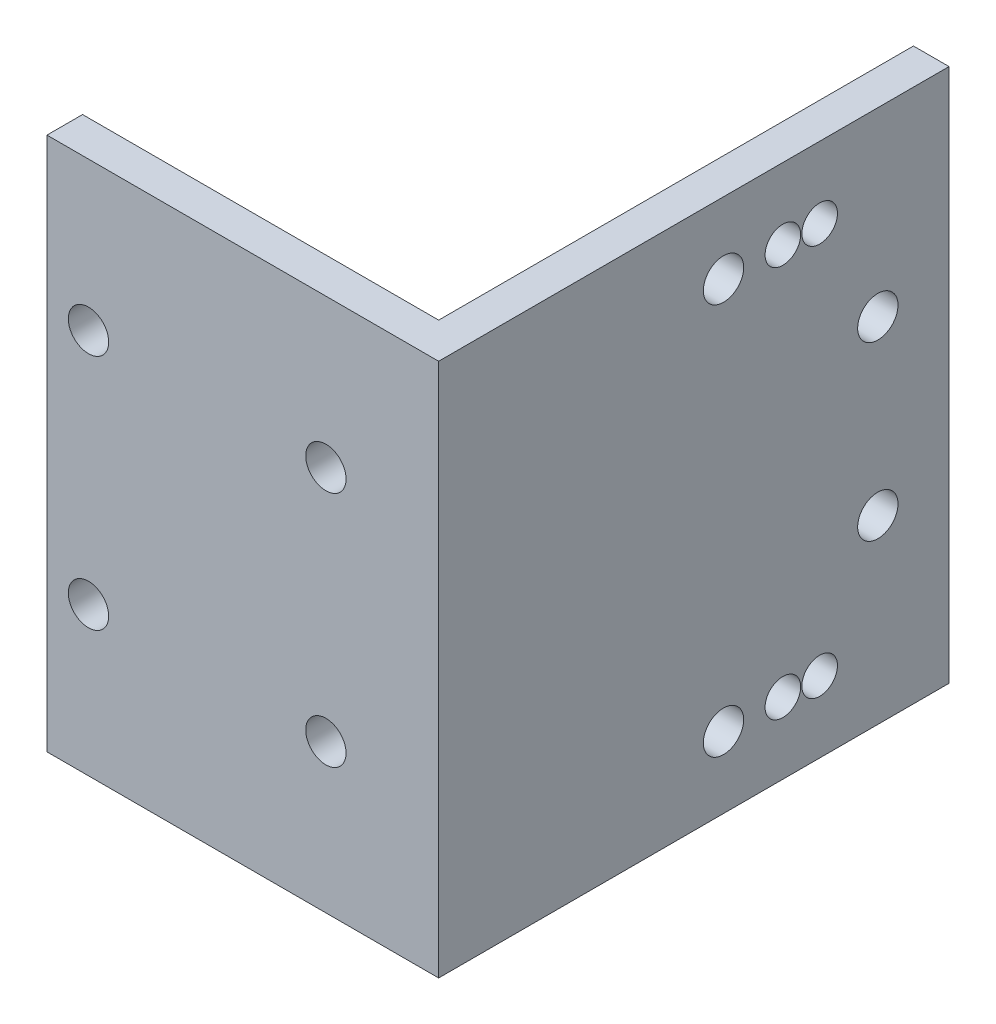
ISO-10303-21;
HEADER;
FILE_DESCRIPTION(('STEP AP214'),'2;1');
FILE_NAME('part.step','',(''),(''),'','','');
FILE_SCHEMA(('AUTOMOTIVE_DESIGN { 1 0 10303 214 1 1 1 1 }'));
ENDSEC;
DATA;
#1=APPLICATION_CONTEXT('core data for automotive mechanical design processes');
#2=APPLICATION_PROTOCOL_DEFINITION('international standard','automotive_design',2000,#1);
#3=PRODUCT_CONTEXT('',#1,'mechanical');
#4=PRODUCT('Part','Part','',(#3));
#5=PRODUCT_RELATED_PRODUCT_CATEGORY('part','',(#4));
#6=PRODUCT_DEFINITION_FORMATION('','',#4);
#7=PRODUCT_DEFINITION_CONTEXT('part definition',#1,'design');
#8=PRODUCT_DEFINITION('design','',#6,#7);
#9=PRODUCT_DEFINITION_SHAPE('','',#8);
#10=(LENGTH_UNIT() NAMED_UNIT(*) SI_UNIT(.MILLI.,.METRE.));
#11=(NAMED_UNIT(*) PLANE_ANGLE_UNIT() SI_UNIT($,.RADIAN.));
#12=(NAMED_UNIT(*) SI_UNIT($,.STERADIAN.) SOLID_ANGLE_UNIT());
#13=UNCERTAINTY_MEASURE_WITH_UNIT(LENGTH_MEASURE(1.E-05),#10,'distance_accuracy_value','');
#14=(GEOMETRIC_REPRESENTATION_CONTEXT(3) GLOBAL_UNCERTAINTY_ASSIGNED_CONTEXT((#13)) GLOBAL_UNIT_ASSIGNED_CONTEXT((#10,
#11,#12)) REPRESENTATION_CONTEXT('',''));
#15=CARTESIAN_POINT('',(0.,0.,0.));
#16=DIRECTION('',(0.,0.,1.));
#17=DIRECTION('',(1.,0.,0.));
#18=AXIS2_PLACEMENT_3D('',#15,#16,#17);
#19=CARTESIAN_POINT('',(0.,45.,0.));
#20=DIRECTION('',(1.,0.,0.));
#21=DIRECTION('',(0.,0.,-1.));
#22=AXIS2_PLACEMENT_3D('',#19,#20,#21);
#23=PLANE('',#22);
#24=DIRECTION('',(0.,0.,1.));
#25=VECTOR('',#24,1.);
#26=CARTESIAN_POINT('',(0.,0.,0.));
#27=LINE('',#26,#25);
#28=CARTESIAN_POINT('',(0.,0.,0.));
#29=VERTEX_POINT('',#28);
#30=CARTESIAN_POINT('',(0.,0.,3.));
#31=VERTEX_POINT('',#30);
#32=EDGE_CURVE('E130',#29,#31,#27,.T.);
#33=ORIENTED_EDGE('',*,*,#32,.T.);
#34=DIRECTION('',(0.,-1.,0.));
#35=VECTOR('',#34,1.);
#36=CARTESIAN_POINT('',(0.,45.,3.));
#37=LINE('',#36,#35);
#38=CARTESIAN_POINT('',(0.,45.,3.));
#39=VERTEX_POINT('',#38);
#40=EDGE_CURVE('E42',#39,#31,#37,.T.);
#41=ORIENTED_EDGE('',*,*,#40,.F.);
#42=DIRECTION('',(0.,0.,1.));
#43=VECTOR('',#42,1.);
#44=CARTESIAN_POINT('',(0.,45.,0.));
#45=LINE('',#44,#43);
#46=CARTESIAN_POINT('',(0.,45.,0.));
#47=VERTEX_POINT('',#46);
#48=EDGE_CURVE('E113',#47,#39,#45,.T.);
#49=ORIENTED_EDGE('',*,*,#48,.F.);
#50=DIRECTION('',(0.,-1.,0.));
#51=VECTOR('',#50,1.);
#52=CARTESIAN_POINT('',(0.,45.,0.));
#53=LINE('',#52,#51);
#54=EDGE_CURVE('E119',#47,#29,#53,.T.);
#55=ORIENTED_EDGE('',*,*,#54,.T.);
#56=EDGE_LOOP('',(#33,#41,#49,#55));
#57=FACE_BOUND('',#56,.T.);
#58=ADVANCED_FACE('F35',(#57),#23,.F.);
#59=CARTESIAN_POINT('',(0.,45.,3.));
#60=DIRECTION('',(0.,0.,-1.));
#61=DIRECTION('',(-1.,0.,0.));
#62=AXIS2_PLACEMENT_3D('',#59,#60,#61);
#63=PLANE('',#62);
#64=CARTESIAN_POINT('',(3.5,12.5,3.));
#65=DIRECTION('',(0.,0.,1.));
#66=DIRECTION('',(1.,0.,0.));
#67=AXIS2_PLACEMENT_3D('',#64,#65,#66);
#68=CIRCLE('',#67,1.7);
#69=CARTESIAN_POINT('',(5.2,12.5,3.));
#70=VERTEX_POINT('',#69);
#71=EDGE_CURVE('E161',#70,#70,#68,.T.);
#72=ORIENTED_EDGE('',*,*,#71,.F.);
#73=EDGE_LOOP('',(#72));
#74=FACE_BOUND('',#73,.T.);
#75=CARTESIAN_POINT('',(23.5,12.5,3.));
#76=DIRECTION('',(0.,0.,1.));
#77=DIRECTION('',(1.,0.,0.));
#78=AXIS2_PLACEMENT_3D('',#75,#76,#77);
#79=CIRCLE('',#78,1.7);
#80=CARTESIAN_POINT('',(25.2,12.5,3.));
#81=VERTEX_POINT('',#80);
#82=EDGE_CURVE('E155',#81,#81,#79,.T.);
#83=ORIENTED_EDGE('',*,*,#82,.F.);
#84=EDGE_LOOP('',(#83));
#85=FACE_BOUND('',#84,.T.);
#86=CARTESIAN_POINT('',(23.5,32.5,3.));
#87=DIRECTION('',(0.,0.,1.));
#88=DIRECTION('',(1.,0.,0.));
#89=AXIS2_PLACEMENT_3D('',#86,#87,#88);
#90=CIRCLE('',#89,1.7);
#91=CARTESIAN_POINT('',(25.2,32.5,3.));
#92=VERTEX_POINT('',#91);
#93=EDGE_CURVE('E149',#92,#92,#90,.T.);
#94=ORIENTED_EDGE('',*,*,#93,.F.);
#95=EDGE_LOOP('',(#94));
#96=FACE_BOUND('',#95,.T.);
#97=CARTESIAN_POINT('',(3.5,32.5,3.));
#98=DIRECTION('',(0.,0.,1.));
#99=DIRECTION('',(1.,0.,0.));
#100=AXIS2_PLACEMENT_3D('',#97,#98,#99);
#101=CIRCLE('',#100,1.7);
#102=CARTESIAN_POINT('',(5.2,32.5,3.));
#103=VERTEX_POINT('',#102);
#104=EDGE_CURVE('E134',#103,#103,#101,.T.);
#105=ORIENTED_EDGE('',*,*,#104,.F.);
#106=EDGE_LOOP('',(#105));
#107=FACE_BOUND('',#106,.T.);
#108=DIRECTION('',(1.,0.,0.));
#109=VECTOR('',#108,1.);
#110=CARTESIAN_POINT('',(0.,0.,3.));
#111=LINE('',#110,#109);
#112=CARTESIAN_POINT('',(33.,0.,3.));
#113=VERTEX_POINT('',#112);
#114=EDGE_CURVE('E115',#31,#113,#111,.T.);
#115=ORIENTED_EDGE('',*,*,#114,.T.);
#116=DIRECTION('',(0.,-1.,0.));
#117=VECTOR('',#116,1.);
#118=CARTESIAN_POINT('',(33.,45.,3.));
#119=LINE('',#118,#117);
#120=CARTESIAN_POINT('',(33.,45.,3.));
#121=VERTEX_POINT('',#120);
#122=EDGE_CURVE('E123',#121,#113,#119,.T.);
#123=ORIENTED_EDGE('',*,*,#122,.F.);
#124=DIRECTION('',(1.,0.,0.));
#125=VECTOR('',#124,1.);
#126=CARTESIAN_POINT('',(0.,45.,3.));
#127=LINE('',#126,#125);
#128=EDGE_CURVE('E86',#39,#121,#127,.T.);
#129=ORIENTED_EDGE('',*,*,#128,.F.);
#130=ORIENTED_EDGE('',*,*,#40,.T.);
#131=EDGE_LOOP('',(#115,#123,#129,#130));
#132=FACE_BOUND('',#131,.T.);
#133=ADVANCED_FACE('F127',(#74,#85,#96,#107,#132),#63,.F.);
#134=CARTESIAN_POINT('',(33.,45.,3.));
#135=DIRECTION('',(-1.,0.,0.));
#136=DIRECTION('',(0.,0.,1.));
#137=AXIS2_PLACEMENT_3D('',#134,#135,#136);
#138=PLANE('',#137);
#139=CARTESIAN_POINT('',(33.,6.00000000000001,-26.));
#140=DIRECTION('',(1.,0.,0.));
#141=DIRECTION('',(0.,0.,1.));
#142=AXIS2_PLACEMENT_3D('',#139,#140,#141);
#143=CIRCLE('',#142,1.5);
#144=CARTESIAN_POINT('',(33.,6.00000000000001,-24.5));
#145=VERTEX_POINT('',#144);
#146=EDGE_CURVE('E209',#145,#145,#143,.T.);
#147=ORIENTED_EDGE('',*,*,#146,.F.);
#148=EDGE_LOOP('',(#147));
#149=FACE_BOUND('',#148,.T.);
#150=CARTESIAN_POINT('',(33.,6.00000000000001,-29.1));
#151=DIRECTION('',(1.,0.,0.));
#152=DIRECTION('',(0.,0.,1.));
#153=AXIS2_PLACEMENT_3D('',#150,#151,#152);
#154=CIRCLE('',#153,1.5);
#155=CARTESIAN_POINT('',(33.,6.00000000000001,-27.6));
#156=VERTEX_POINT('',#155);
#157=EDGE_CURVE('E203',#156,#156,#154,.T.);
#158=ORIENTED_EDGE('',*,*,#157,.F.);
#159=EDGE_LOOP('',(#158));
#160=FACE_BOUND('',#159,.T.);
#161=CARTESIAN_POINT('',(33.,39.,-29.1));
#162=DIRECTION('',(1.,0.,0.));
#163=DIRECTION('',(0.,0.,-1.));
#164=AXIS2_PLACEMENT_3D('',#161,#162,#163);
#165=CIRCLE('',#164,1.5);
#166=CARTESIAN_POINT('',(33.,39.,-30.6));
#167=VERTEX_POINT('',#166);
#168=EDGE_CURVE('E197',#167,#167,#165,.T.);
#169=ORIENTED_EDGE('',*,*,#168,.F.);
#170=EDGE_LOOP('',(#169));
#171=FACE_BOUND('',#170,.T.);
#172=CARTESIAN_POINT('',(33.,39.,-26.));
#173=DIRECTION('',(1.,0.,0.));
#174=DIRECTION('',(0.,0.,-1.));
#175=AXIS2_PLACEMENT_3D('',#172,#173,#174);
#176=CIRCLE('',#175,1.5);
#177=CARTESIAN_POINT('',(33.,39.,-27.5));
#178=VERTEX_POINT('',#177);
#179=EDGE_CURVE('E191',#178,#178,#176,.T.);
#180=ORIENTED_EDGE('',*,*,#179,.F.);
#181=EDGE_LOOP('',(#180));
#182=FACE_BOUND('',#181,.T.);
#183=CARTESIAN_POINT('',(33.,29.75,-34.));
#184=DIRECTION('',(1.,0.,0.));
#185=DIRECTION('',(0.,0.,-1.));
#186=AXIS2_PLACEMENT_3D('',#183,#184,#185);
#187=CIRCLE('',#186,1.7);
#188=CARTESIAN_POINT('',(33.,29.75,-35.7));
#189=VERTEX_POINT('',#188);
#190=EDGE_CURVE('E185',#189,#189,#187,.T.);
#191=ORIENTED_EDGE('',*,*,#190,.F.);
#192=EDGE_LOOP('',(#191));
#193=FACE_BOUND('',#192,.T.);
#194=CARTESIAN_POINT('',(33.,15.25,-34.));
#195=DIRECTION('',(1.,0.,0.));
#196=DIRECTION('',(0.,0.,-1.));
#197=AXIS2_PLACEMENT_3D('',#194,#195,#196);
#198=CIRCLE('',#197,1.7);
#199=CARTESIAN_POINT('',(33.,15.25,-35.7));
#200=VERTEX_POINT('',#199);
#201=EDGE_CURVE('E179',#200,#200,#198,.T.);
#202=ORIENTED_EDGE('',*,*,#201,.F.);
#203=EDGE_LOOP('',(#202));
#204=FACE_BOUND('',#203,.T.);
#205=CARTESIAN_POINT('',(33.,39.,-21.));
#206=DIRECTION('',(1.,0.,0.));
#207=DIRECTION('',(0.,0.,-1.));
#208=AXIS2_PLACEMENT_3D('',#205,#206,#207);
#209=CIRCLE('',#208,1.7);
#210=CARTESIAN_POINT('',(33.,39.,-22.7));
#211=VERTEX_POINT('',#210);
#212=EDGE_CURVE('E173',#211,#211,#209,.T.);
#213=ORIENTED_EDGE('',*,*,#212,.F.);
#214=EDGE_LOOP('',(#213));
#215=FACE_BOUND('',#214,.T.);
#216=CARTESIAN_POINT('',(33.,6.,-21.));
#217=DIRECTION('',(1.,0.,0.));
#218=DIRECTION('',(0.,0.,-1.));
#219=AXIS2_PLACEMENT_3D('',#216,#217,#218);
#220=CIRCLE('',#219,1.7);
#221=CARTESIAN_POINT('',(33.,6.,-22.7));
#222=VERTEX_POINT('',#221);
#223=EDGE_CURVE('E167',#222,#222,#220,.T.);
#224=ORIENTED_EDGE('',*,*,#223,.F.);
#225=EDGE_LOOP('',(#224));
#226=FACE_BOUND('',#225,.T.);
#227=DIRECTION('',(0.,0.,-1.));
#228=VECTOR('',#227,1.);
#229=CARTESIAN_POINT('',(33.,0.,3.));
#230=LINE('',#229,#228);
#231=CARTESIAN_POINT('',(33.,0.,-40.));
#232=VERTEX_POINT('',#231);
#233=EDGE_CURVE('E111',#113,#232,#230,.T.);
#234=ORIENTED_EDGE('',*,*,#233,.T.);
#235=DIRECTION('',(0.,1.,0.));
#236=VECTOR('',#235,1.);
#237=CARTESIAN_POINT('',(33.,45.,-40.));
#238=LINE('',#237,#236);
#239=CARTESIAN_POINT('',(33.,45.,-40.));
#240=VERTEX_POINT('',#239);
#241=EDGE_CURVE('E49',#232,#240,#238,.T.);
#242=ORIENTED_EDGE('',*,*,#241,.T.);
#243=DIRECTION('',(0.,0.,-1.));
#244=VECTOR('',#243,1.);
#245=CARTESIAN_POINT('',(33.,45.,3.));
#246=LINE('',#245,#244);
#247=EDGE_CURVE('E139',#121,#240,#246,.T.);
#248=ORIENTED_EDGE('',*,*,#247,.F.);
#249=ORIENTED_EDGE('',*,*,#122,.T.);
#250=EDGE_LOOP('',(#234,#242,#248,#249));
#251=FACE_BOUND('',#250,.T.);
#252=ADVANCED_FACE('F215',(#149,#160,#171,#182,#193,#204,#215,#226,#251),#138,.F.);
#253=CARTESIAN_POINT('',(30.,45.,0.));
#254=DIRECTION('',(1.,0.,0.));
#255=DIRECTION('',(0.,0.,-1.));
#256=AXIS2_PLACEMENT_3D('',#253,#254,#255);
#257=PLANE('',#256);
#258=CARTESIAN_POINT('',(30.,6.00000000000001,-26.));
#259=DIRECTION('',(1.,0.,0.));
#260=DIRECTION('',(0.,0.,-1.));
#261=AXIS2_PLACEMENT_3D('',#258,#259,#260);
#262=CIRCLE('',#261,1.5);
#263=CARTESIAN_POINT('',(30.,6.00000000000001,-27.5));
#264=VERTEX_POINT('',#263);
#265=EDGE_CURVE('E206',#264,#264,#262,.F.);
#266=ORIENTED_EDGE('',*,*,#265,.F.);
#267=EDGE_LOOP('',(#266));
#268=FACE_BOUND('',#267,.T.);
#269=CARTESIAN_POINT('',(30.,6.00000000000001,-29.1));
#270=DIRECTION('',(1.,0.,0.));
#271=DIRECTION('',(0.,0.,-1.));
#272=AXIS2_PLACEMENT_3D('',#269,#270,#271);
#273=CIRCLE('',#272,1.5);
#274=CARTESIAN_POINT('',(30.,6.00000000000001,-30.6));
#275=VERTEX_POINT('',#274);
#276=EDGE_CURVE('E200',#275,#275,#273,.F.);
#277=ORIENTED_EDGE('',*,*,#276,.F.);
#278=EDGE_LOOP('',(#277));
#279=FACE_BOUND('',#278,.T.);
#280=CARTESIAN_POINT('',(30.,39.,-29.1));
#281=DIRECTION('',(1.,0.,0.));
#282=DIRECTION('',(0.,0.,-1.));
#283=AXIS2_PLACEMENT_3D('',#280,#281,#282);
#284=CIRCLE('',#283,1.5);
#285=CARTESIAN_POINT('',(30.,39.,-30.6));
#286=VERTEX_POINT('',#285);
#287=EDGE_CURVE('E194',#286,#286,#284,.F.);
#288=ORIENTED_EDGE('',*,*,#287,.F.);
#289=EDGE_LOOP('',(#288));
#290=FACE_BOUND('',#289,.T.);
#291=CARTESIAN_POINT('',(30.,39.,-26.));
#292=DIRECTION('',(1.,0.,0.));
#293=DIRECTION('',(0.,0.,-1.));
#294=AXIS2_PLACEMENT_3D('',#291,#292,#293);
#295=CIRCLE('',#294,1.5);
#296=CARTESIAN_POINT('',(30.,39.,-27.5));
#297=VERTEX_POINT('',#296);
#298=EDGE_CURVE('E188',#297,#297,#295,.F.);
#299=ORIENTED_EDGE('',*,*,#298,.F.);
#300=EDGE_LOOP('',(#299));
#301=FACE_BOUND('',#300,.T.);
#302=CARTESIAN_POINT('',(30.,29.75,-34.));
#303=DIRECTION('',(1.,0.,0.));
#304=DIRECTION('',(0.,0.,-1.));
#305=AXIS2_PLACEMENT_3D('',#302,#303,#304);
#306=CIRCLE('',#305,1.7);
#307=CARTESIAN_POINT('',(30.,29.75,-35.7));
#308=VERTEX_POINT('',#307);
#309=EDGE_CURVE('E182',#308,#308,#306,.F.);
#310=ORIENTED_EDGE('',*,*,#309,.F.);
#311=EDGE_LOOP('',(#310));
#312=FACE_BOUND('',#311,.T.);
#313=CARTESIAN_POINT('',(30.,15.25,-34.));
#314=DIRECTION('',(1.,0.,0.));
#315=DIRECTION('',(0.,0.,-1.));
#316=AXIS2_PLACEMENT_3D('',#313,#314,#315);
#317=CIRCLE('',#316,1.7);
#318=CARTESIAN_POINT('',(30.,15.25,-35.7));
#319=VERTEX_POINT('',#318);
#320=EDGE_CURVE('E176',#319,#319,#317,.F.);
#321=ORIENTED_EDGE('',*,*,#320,.F.);
#322=EDGE_LOOP('',(#321));
#323=FACE_BOUND('',#322,.T.);
#324=CARTESIAN_POINT('',(30.,39.,-21.));
#325=DIRECTION('',(1.,0.,0.));
#326=DIRECTION('',(0.,0.,-1.));
#327=AXIS2_PLACEMENT_3D('',#324,#325,#326);
#328=CIRCLE('',#327,1.7);
#329=CARTESIAN_POINT('',(30.,39.,-22.7));
#330=VERTEX_POINT('',#329);
#331=EDGE_CURVE('E170',#330,#330,#328,.F.);
#332=ORIENTED_EDGE('',*,*,#331,.F.);
#333=EDGE_LOOP('',(#332));
#334=FACE_BOUND('',#333,.T.);
#335=CARTESIAN_POINT('',(30.,6.,-21.));
#336=DIRECTION('',(1.,0.,0.));
#337=DIRECTION('',(0.,0.,-1.));
#338=AXIS2_PLACEMENT_3D('',#335,#336,#337);
#339=CIRCLE('',#338,1.7);
#340=CARTESIAN_POINT('',(30.,6.,-22.7));
#341=VERTEX_POINT('',#340);
#342=EDGE_CURVE('E164',#341,#341,#339,.F.);
#343=ORIENTED_EDGE('',*,*,#342,.F.);
#344=EDGE_LOOP('',(#343));
#345=FACE_BOUND('',#344,.T.);
#346=DIRECTION('',(0.,0.,1.));
#347=VECTOR('',#346,1.);
#348=CARTESIAN_POINT('',(30.,45.,0.));
#349=LINE('',#348,#347);
#350=CARTESIAN_POINT('',(30.,45.,-40.));
#351=VERTEX_POINT('',#350);
#352=CARTESIAN_POINT('',(30.,45.,0.));
#353=VERTEX_POINT('',#352);
#354=EDGE_CURVE('E106',#351,#353,#349,.T.);
#355=ORIENTED_EDGE('',*,*,#354,.F.);
#356=DIRECTION('',(0.,-1.,0.));
#357=VECTOR('',#356,1.);
#358=CARTESIAN_POINT('',(30.,45.,-40.));
#359=LINE('',#358,#357);
#360=CARTESIAN_POINT('',(30.,0.,-40.));
#361=VERTEX_POINT('',#360);
#362=EDGE_CURVE('E95',#351,#361,#359,.T.);
#363=ORIENTED_EDGE('',*,*,#362,.T.);
#364=DIRECTION('',(0.,0.,1.));
#365=VECTOR('',#364,1.);
#366=CARTESIAN_POINT('',(30.,0.,0.));
#367=LINE('',#366,#365);
#368=CARTESIAN_POINT('',(30.,0.,0.));
#369=VERTEX_POINT('',#368);
#370=EDGE_CURVE('E105',#361,#369,#367,.T.);
#371=ORIENTED_EDGE('',*,*,#370,.T.);
#372=DIRECTION('',(0.,-1.,0.));
#373=VECTOR('',#372,1.);
#374=CARTESIAN_POINT('',(30.,45.,0.));
#375=LINE('',#374,#373);
#376=EDGE_CURVE('E121',#353,#369,#375,.T.);
#377=ORIENTED_EDGE('',*,*,#376,.F.);
#378=EDGE_LOOP('',(#355,#363,#371,#377));
#379=FACE_BOUND('',#378,.T.);
#380=ADVANCED_FACE('F103',(#268,#279,#290,#301,#312,#323,#334,#345,#379),#257,.F.);
#381=CARTESIAN_POINT('',(0.,45.,0.));
#382=DIRECTION('',(0.,0.,1.));
#383=DIRECTION('',(1.,0.,0.));
#384=AXIS2_PLACEMENT_3D('',#381,#382,#383);
#385=PLANE('',#384);
#386=CARTESIAN_POINT('',(3.5,12.5,0.));
#387=DIRECTION('',(0.,0.,1.));
#388=DIRECTION('',(1.,0.,0.));
#389=AXIS2_PLACEMENT_3D('',#386,#387,#388);
#390=CIRCLE('',#389,1.7);
#391=CARTESIAN_POINT('',(5.2,12.5,0.));
#392=VERTEX_POINT('',#391);
#393=EDGE_CURVE('E158',#392,#392,#390,.F.);
#394=ORIENTED_EDGE('',*,*,#393,.F.);
#395=EDGE_LOOP('',(#394));
#396=FACE_BOUND('',#395,.T.);
#397=CARTESIAN_POINT('',(23.5,12.5,0.));
#398=DIRECTION('',(0.,0.,1.));
#399=DIRECTION('',(1.,0.,0.));
#400=AXIS2_PLACEMENT_3D('',#397,#398,#399);
#401=CIRCLE('',#400,1.7);
#402=CARTESIAN_POINT('',(25.2,12.5,0.));
#403=VERTEX_POINT('',#402);
#404=EDGE_CURVE('E152',#403,#403,#401,.F.);
#405=ORIENTED_EDGE('',*,*,#404,.F.);
#406=EDGE_LOOP('',(#405));
#407=FACE_BOUND('',#406,.T.);
#408=CARTESIAN_POINT('',(23.5,32.5,0.));
#409=DIRECTION('',(0.,0.,1.));
#410=DIRECTION('',(1.,0.,0.));
#411=AXIS2_PLACEMENT_3D('',#408,#409,#410);
#412=CIRCLE('',#411,1.7);
#413=CARTESIAN_POINT('',(25.2,32.5,0.));
#414=VERTEX_POINT('',#413);
#415=EDGE_CURVE('E146',#414,#414,#412,.F.);
#416=ORIENTED_EDGE('',*,*,#415,.F.);
#417=EDGE_LOOP('',(#416));
#418=FACE_BOUND('',#417,.T.);
#419=CARTESIAN_POINT('',(3.5,32.5,0.));
#420=DIRECTION('',(0.,0.,1.));
#421=DIRECTION('',(1.,0.,0.));
#422=AXIS2_PLACEMENT_3D('',#419,#420,#421);
#423=CIRCLE('',#422,1.7);
#424=CARTESIAN_POINT('',(5.2,32.5,0.));
#425=VERTEX_POINT('',#424);
#426=EDGE_CURVE('E131',#425,#425,#423,.F.);
#427=ORIENTED_EDGE('',*,*,#426,.F.);
#428=EDGE_LOOP('',(#427));
#429=FACE_BOUND('',#428,.T.);
#430=DIRECTION('',(-1.,0.,0.));
#431=VECTOR('',#430,1.);
#432=CARTESIAN_POINT('',(0.,0.,0.));
#433=LINE('',#432,#431);
#434=EDGE_CURVE('E78',#369,#29,#433,.T.);
#435=ORIENTED_EDGE('',*,*,#434,.T.);
#436=ORIENTED_EDGE('',*,*,#54,.F.);
#437=DIRECTION('',(-1.,0.,0.));
#438=VECTOR('',#437,1.);
#439=CARTESIAN_POINT('',(0.,45.,0.));
#440=LINE('',#439,#438);
#441=EDGE_CURVE('E57',#353,#47,#440,.T.);
#442=ORIENTED_EDGE('',*,*,#441,.F.);
#443=ORIENTED_EDGE('',*,*,#376,.T.);
#444=EDGE_LOOP('',(#435,#436,#442,#443));
#445=FACE_BOUND('',#444,.T.);
#446=ADVANCED_FACE('F218',(#396,#407,#418,#429,#445),#385,.F.);
#447=CARTESIAN_POINT('',(0.,45.,0.));
#448=DIRECTION('',(0.,1.,0.));
#449=DIRECTION('',(0.,0.,1.));
#450=AXIS2_PLACEMENT_3D('',#447,#448,#449);
#451=PLANE('',#450);
#452=DIRECTION('',(1.,0.,0.));
#453=VECTOR('',#452,1.);
#454=CARTESIAN_POINT('',(-112.700701043292,45.,-40.));
#455=LINE('',#454,#453);
#456=EDGE_CURVE('E107',#351,#240,#455,.T.);
#457=ORIENTED_EDGE('',*,*,#456,.F.);
#458=ORIENTED_EDGE('',*,*,#354,.T.);
#459=ORIENTED_EDGE('',*,*,#441,.T.);
#460=ORIENTED_EDGE('',*,*,#48,.T.);
#461=ORIENTED_EDGE('',*,*,#128,.T.);
#462=ORIENTED_EDGE('',*,*,#247,.T.);
#463=EDGE_LOOP('',(#457,#458,#459,#460,#461,#462));
#464=FACE_BOUND('',#463,.T.);
#465=ADVANCED_FACE('F216',(#464),#451,.T.);
#466=CARTESIAN_POINT('',(0.,0.,0.));
#467=DIRECTION('',(0.,1.,0.));
#468=DIRECTION('',(0.,0.,1.));
#469=AXIS2_PLACEMENT_3D('',#466,#467,#468);
#470=PLANE('',#469);
#471=ORIENTED_EDGE('',*,*,#370,.F.);
#472=DIRECTION('',(1.,0.,0.));
#473=VECTOR('',#472,1.);
#474=CARTESIAN_POINT('',(0.,0.,-40.));
#475=LINE('',#474,#473);
#476=EDGE_CURVE('E11',#361,#232,#475,.T.);
#477=ORIENTED_EDGE('',*,*,#476,.T.);
#478=ORIENTED_EDGE('',*,*,#233,.F.);
#479=ORIENTED_EDGE('',*,*,#114,.F.);
#480=ORIENTED_EDGE('',*,*,#32,.F.);
#481=ORIENTED_EDGE('',*,*,#434,.F.);
#482=EDGE_LOOP('',(#471,#477,#478,#479,#480,#481));
#483=FACE_BOUND('',#482,.T.);
#484=ADVANCED_FACE('F109',(#483),#470,.F.);
#485=CARTESIAN_POINT('',(3.5,32.5,-60.001));
#486=DIRECTION('',(0.,0.,1.));
#487=DIRECTION('',(1.,0.,0.));
#488=AXIS2_PLACEMENT_3D('',#485,#486,#487);
#489=CYLINDRICAL_SURFACE('',#488,1.7);
#490=ORIENTED_EDGE('',*,*,#104,.T.);
#491=EDGE_LOOP('',(#490));
#492=FACE_BOUND('',#491,.T.);
#493=ORIENTED_EDGE('',*,*,#426,.T.);
#494=EDGE_LOOP('',(#493));
#495=FACE_BOUND('',#494,.T.);
#496=ADVANCED_FACE('F224',(#492,#495),#489,.F.);
#497=CARTESIAN_POINT('',(23.5,32.5,-60.001));
#498=DIRECTION('',(0.,0.,1.));
#499=DIRECTION('',(1.,0.,0.));
#500=AXIS2_PLACEMENT_3D('',#497,#498,#499);
#501=CYLINDRICAL_SURFACE('',#500,1.7);
#502=ORIENTED_EDGE('',*,*,#93,.T.);
#503=EDGE_LOOP('',(#502));
#504=FACE_BOUND('',#503,.T.);
#505=ORIENTED_EDGE('',*,*,#415,.T.);
#506=EDGE_LOOP('',(#505));
#507=FACE_BOUND('',#506,.T.);
#508=ADVANCED_FACE('F282',(#504,#507),#501,.F.);
#509=CARTESIAN_POINT('',(23.5,12.5,-60.001));
#510=DIRECTION('',(0.,0.,1.));
#511=DIRECTION('',(1.,0.,0.));
#512=AXIS2_PLACEMENT_3D('',#509,#510,#511);
#513=CYLINDRICAL_SURFACE('',#512,1.7);
#514=ORIENTED_EDGE('',*,*,#82,.T.);
#515=EDGE_LOOP('',(#514));
#516=FACE_BOUND('',#515,.T.);
#517=ORIENTED_EDGE('',*,*,#404,.T.);
#518=EDGE_LOOP('',(#517));
#519=FACE_BOUND('',#518,.T.);
#520=ADVANCED_FACE('F275',(#516,#519),#513,.F.);
#521=CARTESIAN_POINT('',(3.5,12.5,-60.001));
#522=DIRECTION('',(0.,0.,1.));
#523=DIRECTION('',(1.,0.,0.));
#524=AXIS2_PLACEMENT_3D('',#521,#522,#523);
#525=CYLINDRICAL_SURFACE('',#524,1.7);
#526=ORIENTED_EDGE('',*,*,#71,.T.);
#527=EDGE_LOOP('',(#526));
#528=FACE_BOUND('',#527,.T.);
#529=ORIENTED_EDGE('',*,*,#393,.T.);
#530=EDGE_LOOP('',(#529));
#531=FACE_BOUND('',#530,.T.);
#532=ADVANCED_FACE('F265',(#528,#531),#525,.F.);
#533=CARTESIAN_POINT('',(-0.001000000000001,6.,-21.));
#534=DIRECTION('',(1.,0.,0.));
#535=DIRECTION('',(0.,0.,-1.));
#536=AXIS2_PLACEMENT_3D('',#533,#534,#535);
#537=CYLINDRICAL_SURFACE('',#536,1.7);
#538=ORIENTED_EDGE('',*,*,#223,.T.);
#539=EDGE_LOOP('',(#538));
#540=FACE_BOUND('',#539,.T.);
#541=ORIENTED_EDGE('',*,*,#342,.T.);
#542=EDGE_LOOP('',(#541));
#543=FACE_BOUND('',#542,.T.);
#544=ADVANCED_FACE('F262',(#540,#543),#537,.F.);
#545=CARTESIAN_POINT('',(-0.001000000000001,39.,-21.));
#546=DIRECTION('',(1.,0.,0.));
#547=DIRECTION('',(0.,0.,-1.));
#548=AXIS2_PLACEMENT_3D('',#545,#546,#547);
#549=CYLINDRICAL_SURFACE('',#548,1.7);
#550=ORIENTED_EDGE('',*,*,#212,.T.);
#551=EDGE_LOOP('',(#550));
#552=FACE_BOUND('',#551,.T.);
#553=ORIENTED_EDGE('',*,*,#331,.T.);
#554=EDGE_LOOP('',(#553));
#555=FACE_BOUND('',#554,.T.);
#556=ADVANCED_FACE('F264',(#552,#555),#549,.F.);
#557=CARTESIAN_POINT('',(-0.001000000000001,15.25,-34.));
#558=DIRECTION('',(1.,0.,0.));
#559=DIRECTION('',(0.,0.,-1.));
#560=AXIS2_PLACEMENT_3D('',#557,#558,#559);
#561=CYLINDRICAL_SURFACE('',#560,1.7);
#562=ORIENTED_EDGE('',*,*,#201,.T.);
#563=EDGE_LOOP('',(#562));
#564=FACE_BOUND('',#563,.T.);
#565=ORIENTED_EDGE('',*,*,#320,.T.);
#566=EDGE_LOOP('',(#565));
#567=FACE_BOUND('',#566,.T.);
#568=ADVANCED_FACE('F272',(#564,#567),#561,.F.);
#569=CARTESIAN_POINT('',(-0.001000000000001,29.75,-34.));
#570=DIRECTION('',(1.,0.,0.));
#571=DIRECTION('',(0.,0.,-1.));
#572=AXIS2_PLACEMENT_3D('',#569,#570,#571);
#573=CYLINDRICAL_SURFACE('',#572,1.7);
#574=ORIENTED_EDGE('',*,*,#190,.T.);
#575=EDGE_LOOP('',(#574));
#576=FACE_BOUND('',#575,.T.);
#577=ORIENTED_EDGE('',*,*,#309,.T.);
#578=EDGE_LOOP('',(#577));
#579=FACE_BOUND('',#578,.T.);
#580=ADVANCED_FACE('F329',(#576,#579),#573,.F.);
#581=CARTESIAN_POINT('',(-0.001000000000001,39.,-26.));
#582=DIRECTION('',(1.,0.,0.));
#583=DIRECTION('',(0.,0.,-1.));
#584=AXIS2_PLACEMENT_3D('',#581,#582,#583);
#585=CYLINDRICAL_SURFACE('',#584,1.5);
#586=ORIENTED_EDGE('',*,*,#179,.T.);
#587=EDGE_LOOP('',(#586));
#588=FACE_BOUND('',#587,.T.);
#589=ORIENTED_EDGE('',*,*,#298,.T.);
#590=EDGE_LOOP('',(#589));
#591=FACE_BOUND('',#590,.T.);
#592=ADVANCED_FACE('F338',(#588,#591),#585,.F.);
#593=CARTESIAN_POINT('',(-0.001000000000001,39.,-29.1));
#594=DIRECTION('',(1.,0.,0.));
#595=DIRECTION('',(0.,0.,-1.));
#596=AXIS2_PLACEMENT_3D('',#593,#594,#595);
#597=CYLINDRICAL_SURFACE('',#596,1.5);
#598=ORIENTED_EDGE('',*,*,#168,.T.);
#599=EDGE_LOOP('',(#598));
#600=FACE_BOUND('',#599,.T.);
#601=ORIENTED_EDGE('',*,*,#287,.T.);
#602=EDGE_LOOP('',(#601));
#603=FACE_BOUND('',#602,.T.);
#604=ADVANCED_FACE('F348',(#600,#603),#597,.F.);
#605=CARTESIAN_POINT('',(-0.001000000000001,6.00000000000001,-29.1));
#606=DIRECTION('',(1.,0.,0.));
#607=DIRECTION('',(0.,0.,-1.));
#608=AXIS2_PLACEMENT_3D('',#605,#606,#607);
#609=CYLINDRICAL_SURFACE('',#608,1.5);
#610=ORIENTED_EDGE('',*,*,#157,.T.);
#611=EDGE_LOOP('',(#610));
#612=FACE_BOUND('',#611,.T.);
#613=ORIENTED_EDGE('',*,*,#276,.T.);
#614=EDGE_LOOP('',(#613));
#615=FACE_BOUND('',#614,.T.);
#616=ADVANCED_FACE('F358',(#612,#615),#609,.F.);
#617=CARTESIAN_POINT('',(-0.001000000000001,6.00000000000001,-26.));
#618=DIRECTION('',(1.,0.,0.));
#619=DIRECTION('',(0.,0.,-1.));
#620=AXIS2_PLACEMENT_3D('',#617,#618,#619);
#621=CYLINDRICAL_SURFACE('',#620,1.5);
#622=ORIENTED_EDGE('',*,*,#146,.T.);
#623=EDGE_LOOP('',(#622));
#624=FACE_BOUND('',#623,.T.);
#625=ORIENTED_EDGE('',*,*,#265,.T.);
#626=EDGE_LOOP('',(#625));
#627=FACE_BOUND('',#626,.T.);
#628=ADVANCED_FACE('F368',(#624,#627),#621,.F.);
#629=CARTESIAN_POINT('',(-112.700701043292,45.,-40.));
#630=DIRECTION('',(0.,0.,1.));
#631=DIRECTION('',(0.,-1.,0.));
#632=AXIS2_PLACEMENT_3D('',#629,#630,#631);
#633=PLANE('',#632);
#634=ORIENTED_EDGE('',*,*,#241,.F.);
#635=ORIENTED_EDGE('',*,*,#476,.F.);
#636=ORIENTED_EDGE('',*,*,#362,.F.);
#637=ORIENTED_EDGE('',*,*,#456,.T.);
#638=EDGE_LOOP('',(#634,#635,#636,#637));
#639=FACE_BOUND('',#638,.T.);
#640=ADVANCED_FACE('F94',(#639),#633,.F.);
#641=CLOSED_SHELL('',(#58,#133,#252,#380,#446,#465,#484,#496,#508,#520,#532,#544,#556,#568,#580,
#592,#604,#616,#628,#640));
#642=MANIFOLD_SOLID_BREP('B2',#641);
#643=ADVANCED_BREP_SHAPE_REPRESENTATION('',(#18,#642),#14);
#644=SHAPE_DEFINITION_REPRESENTATION(#9,#643);
ENDSEC;
END-ISO-10303-21;
